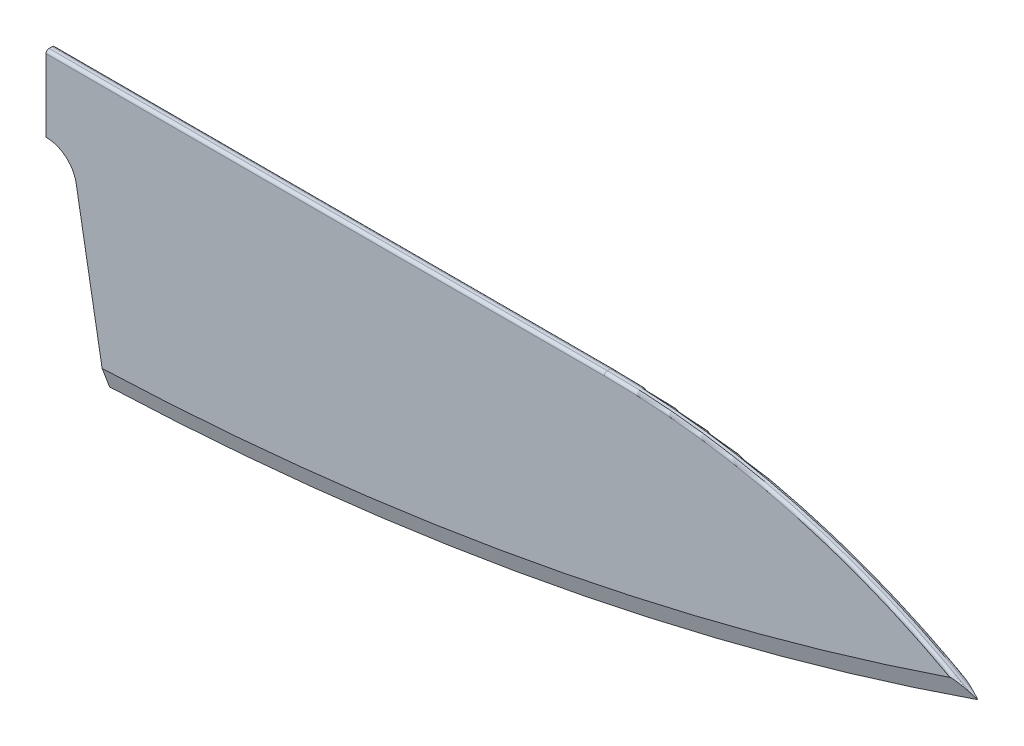
ISO-10303-21;
HEADER;
FILE_DESCRIPTION(('STEP AP214'),'2;1');
FILE_NAME('part.step','',(''),(''),'','','');
FILE_SCHEMA(('AUTOMOTIVE_DESIGN { 1 0 10303 214 1 1 1 1 }'));
ENDSEC;
DATA;
#1=APPLICATION_CONTEXT('core data for automotive mechanical design processes');
#2=APPLICATION_PROTOCOL_DEFINITION('international standard','automotive_design',2000,#1);
#3=PRODUCT_CONTEXT('',#1,'mechanical');
#4=PRODUCT('Part','Part','',(#3));
#5=PRODUCT_RELATED_PRODUCT_CATEGORY('part','',(#4));
#6=PRODUCT_DEFINITION_FORMATION('','',#4);
#7=PRODUCT_DEFINITION_CONTEXT('part definition',#1,'design');
#8=PRODUCT_DEFINITION('design','',#6,#7);
#9=PRODUCT_DEFINITION_SHAPE('','',#8);
#10=(LENGTH_UNIT() NAMED_UNIT(*) SI_UNIT(.MILLI.,.METRE.));
#11=(NAMED_UNIT(*) PLANE_ANGLE_UNIT() SI_UNIT($,.RADIAN.));
#12=(NAMED_UNIT(*) SI_UNIT($,.STERADIAN.) SOLID_ANGLE_UNIT());
#13=UNCERTAINTY_MEASURE_WITH_UNIT(LENGTH_MEASURE(1.E-05),#10,'distance_accuracy_value','');
#14=(GEOMETRIC_REPRESENTATION_CONTEXT(3) GLOBAL_UNCERTAINTY_ASSIGNED_CONTEXT((#13)) GLOBAL_UNIT_ASSIGNED_CONTEXT((#10,
#11,#12)) REPRESENTATION_CONTEXT('',''));
#15=CARTESIAN_POINT('',(0.,0.,0.));
#16=DIRECTION('',(0.,0.,1.));
#17=DIRECTION('',(1.,0.,0.));
#18=AXIS2_PLACEMENT_3D('',#15,#16,#17);
#19=CARTESIAN_POINT('',(180.,-10.,1.5));
#20=DIRECTION('',(1.,0.,0.));
#21=DIRECTION('',(0.,0.,-1.));
#22=AXIS2_PLACEMENT_3D('',#19,#20,#21);
#23=PLANE('',#22);
#24=DIRECTION('',(0.,0.,-1.));
#25=VECTOR('',#24,1.);
#26=CARTESIAN_POINT('',(180.,-10.,1.5));
#27=LINE('',#26,#25);
#28=CARTESIAN_POINT('',(180.,-10.,0.5));
#29=VERTEX_POINT('',#28);
#30=CARTESIAN_POINT('',(180.,-10.,-0.5));
#31=VERTEX_POINT('',#30);
#32=EDGE_CURVE('E268',#29,#31,#27,.T.);
#33=ORIENTED_EDGE('',*,*,#32,.T.);
#34=CARTESIAN_POINT('',(180.,-11.,-0.5));
#35=DIRECTION('',(1.,0.,0.));
#36=DIRECTION('',(0.,0.,-1.));
#37=AXIS2_PLACEMENT_3D('',#34,#35,#36);
#38=CIRCLE('',#37,1.);
#39=CARTESIAN_POINT('',(180.,-11.,-1.5));
#40=VERTEX_POINT('',#39);
#41=EDGE_CURVE('E11',#31,#40,#38,.F.);
#42=ORIENTED_EDGE('',*,*,#41,.T.);
#43=DIRECTION('',(0.,-1.,0.));
#44=VECTOR('',#43,1.);
#45=CARTESIAN_POINT('',(180.,-10.,-1.5));
#46=LINE('',#45,#44);
#47=CARTESIAN_POINT('',(180.,-35.,-1.5));
#48=VERTEX_POINT('',#47);
#49=EDGE_CURVE('E138',#40,#48,#46,.T.);
#50=ORIENTED_EDGE('',*,*,#49,.T.);
#51=DIRECTION('',(0.,0.,-1.));
#52=VECTOR('',#51,1.);
#53=CARTESIAN_POINT('',(180.,-35.,1.5));
#54=LINE('',#53,#52);
#55=CARTESIAN_POINT('',(180.,-35.,1.5));
#56=VERTEX_POINT('',#55);
#57=EDGE_CURVE('E131',#56,#48,#54,.T.);
#58=ORIENTED_EDGE('',*,*,#57,.F.);
#59=DIRECTION('',(0.,-1.,0.));
#60=VECTOR('',#59,1.);
#61=CARTESIAN_POINT('',(180.,-10.,1.5));
#62=LINE('',#61,#60);
#63=CARTESIAN_POINT('',(180.,-11.,1.5));
#64=VERTEX_POINT('',#63);
#65=EDGE_CURVE('E116',#64,#56,#62,.T.);
#66=ORIENTED_EDGE('',*,*,#65,.F.);
#67=CARTESIAN_POINT('',(180.,-11.,0.5));
#68=DIRECTION('',(1.,0.,0.));
#69=DIRECTION('',(0.,0.,-1.));
#70=AXIS2_PLACEMENT_3D('',#67,#68,#69);
#71=CIRCLE('',#70,1.);
#72=EDGE_CURVE('E42',#64,#29,#71,.F.);
#73=ORIENTED_EDGE('',*,*,#72,.T.);
#74=EDGE_LOOP('',(#33,#42,#50,#58,#66,#73));
#75=FACE_BOUND('',#74,.T.);
#76=ADVANCED_FACE('F33',(#75),#23,.F.);
#77=CARTESIAN_POINT('',(180.,-35.,1.5));
#78=DIRECTION('',(0.,1.,0.));
#79=DIRECTION('',(0.,0.,1.));
#80=AXIS2_PLACEMENT_3D('',#77,#78,#79);
#81=PLANE('',#80);
#82=DIRECTION('',(1.,0.,0.));
#83=VECTOR('',#82,1.);
#84=CARTESIAN_POINT('',(180.,-35.,-1.5));
#85=LINE('',#84,#83);
#86=CARTESIAN_POINT('',(180.147749942177,-35.,-1.5));
#87=VERTEX_POINT('',#86);
#88=EDGE_CURVE('E276',#48,#87,#85,.T.);
#89=ORIENTED_EDGE('',*,*,#88,.T.);
#90=DIRECTION('',(0.,0.,-1.));
#91=VECTOR('',#90,1.);
#92=CARTESIAN_POINT('',(180.147749942177,-35.,1.5));
#93=LINE('',#92,#91);
#94=CARTESIAN_POINT('',(180.147749942177,-35.,1.5));
#95=VERTEX_POINT('',#94);
#96=EDGE_CURVE('E133',#95,#87,#93,.T.);
#97=ORIENTED_EDGE('',*,*,#96,.F.);
#98=DIRECTION('',(1.,0.,0.));
#99=VECTOR('',#98,1.);
#100=CARTESIAN_POINT('',(180.,-35.,1.5));
#101=LINE('',#100,#99);
#102=EDGE_CURVE('E120',#56,#95,#101,.T.);
#103=ORIENTED_EDGE('',*,*,#102,.F.);
#104=ORIENTED_EDGE('',*,*,#57,.T.);
#105=EDGE_LOOP('',(#89,#97,#103,#104));
#106=FACE_BOUND('',#105,.T.);
#107=ADVANCED_FACE('F130',(#106),#81,.F.);
#108=CARTESIAN_POINT('',(180.147749942177,-45.,1.5));
#109=DIRECTION('',(0.,0.,-1.));
#110=DIRECTION('',(-1.,0.,0.));
#111=AXIS2_PLACEMENT_3D('',#108,#109,#110);
#112=CYLINDRICAL_SURFACE('',#111,10.);
#113=CARTESIAN_POINT('',(180.147749942177,-45.,-1.5));
#114=DIRECTION('',(0.,0.,-1.));
#115=DIRECTION('',(-1.,0.,0.));
#116=AXIS2_PLACEMENT_3D('',#113,#114,#115);
#117=CIRCLE('',#116,10.);
#118=CARTESIAN_POINT('',(189.995827472299,-43.2635182233307,-1.5));
#119=VERTEX_POINT('',#118);
#120=EDGE_CURVE('E274',#87,#119,#117,.T.);
#121=ORIENTED_EDGE('',*,*,#120,.T.);
#122=DIRECTION('',(0.,0.,-1.));
#123=VECTOR('',#122,1.);
#124=CARTESIAN_POINT('',(189.995827472299,-43.2635182233307,1.5));
#125=LINE('',#124,#123);
#126=CARTESIAN_POINT('',(189.995827472299,-43.2635182233307,1.5));
#127=VERTEX_POINT('',#126);
#128=EDGE_CURVE('E144',#127,#119,#125,.T.);
#129=ORIENTED_EDGE('',*,*,#128,.F.);
#130=CARTESIAN_POINT('',(180.147749942177,-45.,1.5));
#131=DIRECTION('',(0.,0.,-1.));
#132=DIRECTION('',(-1.,0.,0.));
#133=AXIS2_PLACEMENT_3D('',#130,#131,#132);
#134=CIRCLE('',#133,10.);
#135=EDGE_CURVE('E135',#95,#127,#134,.T.);
#136=ORIENTED_EDGE('',*,*,#135,.F.);
#137=ORIENTED_EDGE('',*,*,#96,.T.);
#138=EDGE_LOOP('',(#121,#129,#136,#137));
#139=FACE_BOUND('',#138,.T.);
#140=ADVANCED_FACE('F174',(#139),#112,.F.);
#141=CARTESIAN_POINT('',(189.995827472299,-43.2635182233307,1.5));
#142=DIRECTION('',(0.984807753012209,0.173648177666927,0.));
#143=DIRECTION('',(-0.173648177666927,0.984807753012209,0.));
#144=AXIS2_PLACEMENT_3D('',#141,#142,#143);
#145=PLANE('',#144);
#146=DIRECTION('',(0.173648177666927,-0.984807753012209,0.));
#147=VECTOR('',#146,1.);
#148=CARTESIAN_POINT('',(189.995827472299,-43.2635182233307,-1.5));
#149=LINE('',#148,#147);
#150=CARTESIAN_POINT('',(198.597834340001,-92.0479233843533,-1.5));
#151=VERTEX_POINT('',#150);
#152=EDGE_CURVE('E126',#119,#151,#149,.T.);
#153=ORIENTED_EDGE('',*,*,#152,.T.);
#154=CARTESIAN_POINT('',(198.597834340001,-92.0479233843533,-1.5));
#155=CARTESIAN_POINT('',(198.831529776716,-93.3732760659239,-1.14275957484062));
#156=CARTESIAN_POINT('',(199.065224633407,-94.6986254580133,-0.785506567306787));
#157=CARTESIAN_POINT('',(199.53261318674,-97.3493176632288,-0.0709753874904686));
#158=CARTESIAN_POINT('',(199.766306883382,-98.6746604763549,0.286302784792017));
#159=CARTESIAN_POINT('',(200.,-99.9999999999998,0.643593539448956));
#160=B_SPLINE_CURVE_WITH_KNOTS('',3,(#154,#155,#156,#157,#158,#159),.UNSPECIFIED.,.F.,.F.,(4,2,
4),(0.,4.17721750414407,8.3544350082852),.UNSPECIFIED.);
#161=CARTESIAN_POINT('',(199.579035294314,-97.6125905179427,0.));
#162=VERTEX_POINT('',#161);
#163=EDGE_CURVE('E184',#151,#162,#160,.T.);
#164=ORIENTED_EDGE('',*,*,#163,.T.);
#165=CARTESIAN_POINT('',(200.,-99.9999999999999,-0.643593539448985));
#166=CARTESIAN_POINT('',(199.766306883382,-98.6746604763549,-0.286302784792028));
#167=CARTESIAN_POINT('',(199.53261318674,-97.3493176632288,0.0709753874904697));
#168=CARTESIAN_POINT('',(199.065224633407,-94.6986254580133,0.785506567306798));
#169=CARTESIAN_POINT('',(198.831529776716,-93.3732760659239,1.14275957484063));
#170=CARTESIAN_POINT('',(198.597834340001,-92.0479233843533,1.5));
#171=B_SPLINE_CURVE_WITH_KNOTS('',3,(#165,#166,#167,#168,#169,#170),.UNSPECIFIED.,.F.,.F.,(4,2,
4),(0.,4.17721750414114,8.35443500828521),.UNSPECIFIED.);
#172=CARTESIAN_POINT('',(198.597834340001,-92.0479233843533,1.5));
#173=VERTEX_POINT('',#172);
#174=EDGE_CURVE('E179',#162,#173,#171,.T.);
#175=ORIENTED_EDGE('',*,*,#174,.T.);
#176=DIRECTION('',(0.173648177666927,-0.984807753012209,0.));
#177=VECTOR('',#176,1.);
#178=CARTESIAN_POINT('',(189.995827472299,-43.2635182233307,1.5));
#179=LINE('',#178,#177);
#180=EDGE_CURVE('E246',#127,#173,#179,.T.);
#181=ORIENTED_EDGE('',*,*,#180,.F.);
#182=ORIENTED_EDGE('',*,*,#128,.T.);
#183=EDGE_LOOP('',(#153,#164,#175,#181,#182));
#184=FACE_BOUND('',#183,.T.);
#185=ADVANCED_FACE('F167',(#184),#145,.F.);
#186=CARTESIAN_POINT('',(365.,-250.,1.5));
#187=DIRECTION('',(0.,0.,-1.));
#188=DIRECTION('',(-1.,0.,0.));
#189=AXIS2_PLACEMENT_3D('',#186,#187,#188);
#190=CYLINDRICAL_SURFACE('',#189,240.);
#191=CARTESIAN_POINT('',(490.,-45.121987514521,0.643593539448985));
#192=CARTESIAN_POINT('',(488.495942114908,-44.2043312113068,0.278838372767636));
#193=CARTESIAN_POINT('',(486.981165221059,-43.3028666849665,-0.0822618234806008));
#194=CARTESIAN_POINT('',(484.693425498114,-41.9753352875074,-0.618216463830511));
#195=CARTESIAN_POINT('',(483.928267418784,-41.536945398964,-0.795914762927347));
#196=CARTESIAN_POINT('',(482.392733841631,-40.6683868953586,-1.14940294835419));
#197=CARTESIAN_POINT('',(481.622357722227,-40.2382192839319,-1.32519260059212));
#198=CARTESIAN_POINT('',(480.849457964437,-39.8122194575858,-1.49999999999997));
#199=B_SPLINE_CURVE_WITH_KNOTS('',3,(#191,#192,#193,#194,#195,#196,#197,#198),.UNSPECIFIED.,.F.,
.F.,(4,2,2,4),(0.,5.39757314775405,8.09623711541611,10.7952284130574),.UNSPECIFIED.);
#200=CARTESIAN_POINT('',(487.319020761774,-43.51015240482,0.));
#201=VERTEX_POINT('',#200);
#202=CARTESIAN_POINT('',(485.197782442825,-42.2682183780555,-0.499999999999993));
#203=VERTEX_POINT('',#202);
#204=EDGE_CURVE('E142',#201,#203,#199,.T.);
#205=ORIENTED_EDGE('',*,*,#204,.T.);
#206=CARTESIAN_POINT('',(365.,-250.,-0.5));
#207=DIRECTION('',(0.,0.,-1.));
#208=DIRECTION('',(-1.,0.,0.));
#209=AXIS2_PLACEMENT_3D('',#206,#207,#208);
#210=CIRCLE('',#209,240.);
#211=CARTESIAN_POINT('',(365.,-10.,-0.5));
#212=VERTEX_POINT('',#211);
#213=EDGE_CURVE('E249',#203,#212,#210,.F.);
#214=ORIENTED_EDGE('',*,*,#213,.T.);
#215=DIRECTION('',(0.,0.,-1.));
#216=VECTOR('',#215,1.);
#217=CARTESIAN_POINT('',(365.,-10.,1.5));
#218=LINE('',#217,#216);
#219=CARTESIAN_POINT('',(365.,-10.,0.5));
#220=VERTEX_POINT('',#219);
#221=EDGE_CURVE('E267',#220,#212,#218,.T.);
#222=ORIENTED_EDGE('',*,*,#221,.F.);
#223=CARTESIAN_POINT('',(365.,-250.,0.5));
#224=DIRECTION('',(0.,0.,-1.));
#225=DIRECTION('',(-1.,0.,0.));
#226=AXIS2_PLACEMENT_3D('',#223,#224,#225);
#227=CIRCLE('',#226,240.);
#228=CARTESIAN_POINT('',(485.197782442825,-42.2682183780554,0.500000000000017));
#229=VERTEX_POINT('',#228);
#230=EDGE_CURVE('E240',#220,#229,#227,.T.);
#231=ORIENTED_EDGE('',*,*,#230,.T.);
#232=CARTESIAN_POINT('',(480.849457964437,-39.8122194575857,1.5));
#233=CARTESIAN_POINT('',(481.622357722227,-40.2382192839319,1.32519260059212));
#234=CARTESIAN_POINT('',(482.392733841631,-40.6683868953586,1.14940294835418));
#235=CARTESIAN_POINT('',(483.928267418784,-41.536945398964,0.795914762927346));
#236=CARTESIAN_POINT('',(484.693425498114,-41.9753352875074,0.618216463830525));
#237=CARTESIAN_POINT('',(486.981165221059,-43.3028666849664,0.0822618234806651));
#238=CARTESIAN_POINT('',(488.495942114908,-44.2043312113068,-0.278838372767532));
#239=CARTESIAN_POINT('',(490.,-45.1219875145211,-0.643593539448925));
#240=B_SPLINE_CURVE_WITH_KNOTS('',3,(#232,#233,#234,#235,#236,#237,#238,#239),.UNSPECIFIED.,.F.,
.F.,(4,2,2,4),(0.,2.69899129764124,5.39765526530331,10.7952284130573),.UNSPECIFIED.);
#241=EDGE_CURVE('E140',#229,#201,#240,.T.);
#242=ORIENTED_EDGE('',*,*,#241,.T.);
#243=EDGE_LOOP('',(#205,#214,#222,#231,#242));
#244=FACE_BOUND('',#243,.T.);
#245=ADVANCED_FACE('F161',(#244),#190,.T.);
#246=CARTESIAN_POINT('',(180.,-10.,1.5));
#247=DIRECTION('',(0.,-1.,0.));
#248=DIRECTION('',(0.,0.,-1.));
#249=AXIS2_PLACEMENT_3D('',#246,#247,#248);
#250=PLANE('',#249);
#251=ORIENTED_EDGE('',*,*,#221,.T.);
#252=DIRECTION('',(-1.,0.,0.));
#253=VECTOR('',#252,1.);
#254=CARTESIAN_POINT('',(180.,-10.,-0.5));
#255=LINE('',#254,#253);
#256=EDGE_CURVE('E50',#212,#31,#255,.T.);
#257=ORIENTED_EDGE('',*,*,#256,.T.);
#258=ORIENTED_EDGE('',*,*,#32,.F.);
#259=DIRECTION('',(-1.,0.,0.));
#260=VECTOR('',#259,1.);
#261=CARTESIAN_POINT('',(180.,-10.,0.5));
#262=LINE('',#261,#260);
#263=EDGE_CURVE('E226',#29,#220,#262,.F.);
#264=ORIENTED_EDGE('',*,*,#263,.T.);
#265=EDGE_LOOP('',(#251,#257,#258,#264));
#266=FACE_BOUND('',#265,.T.);
#267=ADVANCED_FACE('F166',(#266),#250,.F.);
#268=CARTESIAN_POINT('',(180.147749942177,-45.,1.5));
#269=DIRECTION('',(0.,0.,-1.));
#270=DIRECTION('',(-1.,0.,0.));
#271=AXIS2_PLACEMENT_3D('',#268,#269,#270);
#272=PLANE('',#271);
#273=CARTESIAN_POINT('',(161.10110338796,899.243151511366,1.5));
#274=DIRECTION('',(0.,0.,-1.));
#275=DIRECTION('',(-1.,0.,0.));
#276=AXIS2_PLACEMENT_3D('',#273,#274,#275);
#277=CIRCLE('',#276,992.);
#278=CARTESIAN_POINT('',(479.56556538503,-40.2484058987669,1.5));
#279=VERTEX_POINT('',#278);
#280=EDGE_CURVE('E189',#173,#279,#277,.F.);
#281=ORIENTED_EDGE('',*,*,#280,.T.);
#282=CARTESIAN_POINT('',(365.,-250.,1.5));
#283=DIRECTION('',(0.,0.,-1.));
#284=DIRECTION('',(-1.,0.,0.));
#285=AXIS2_PLACEMENT_3D('',#282,#283,#284);
#286=CIRCLE('',#285,239.);
#287=CARTESIAN_POINT('',(365.,-11.,1.5));
#288=VERTEX_POINT('',#287);
#289=EDGE_CURVE('E227',#279,#288,#286,.F.);
#290=ORIENTED_EDGE('',*,*,#289,.T.);
#291=DIRECTION('',(-1.,0.,0.));
#292=VECTOR('',#291,1.);
#293=CARTESIAN_POINT('',(180.147749942177,-11.,1.5));
#294=LINE('',#293,#292);
#295=EDGE_CURVE('E124',#288,#64,#294,.T.);
#296=ORIENTED_EDGE('',*,*,#295,.T.);
#297=ORIENTED_EDGE('',*,*,#65,.T.);
#298=ORIENTED_EDGE('',*,*,#102,.T.);
#299=ORIENTED_EDGE('',*,*,#135,.T.);
#300=ORIENTED_EDGE('',*,*,#180,.T.);
#301=EDGE_LOOP('',(#281,#290,#296,#297,#298,#299,#300));
#302=FACE_BOUND('',#301,.T.);
#303=ADVANCED_FACE('F119',(#302),#272,.F.);
#304=CARTESIAN_POINT('',(180.147749942177,-45.,-1.5));
#305=DIRECTION('',(0.,0.,-1.));
#306=DIRECTION('',(-1.,0.,0.));
#307=AXIS2_PLACEMENT_3D('',#304,#305,#306);
#308=PLANE('',#307);
#309=DIRECTION('',(-1.,0.,0.));
#310=VECTOR('',#309,1.);
#311=CARTESIAN_POINT('',(365.,-11.,-1.5));
#312=LINE('',#311,#310);
#313=CARTESIAN_POINT('',(365.,-11.,-1.5));
#314=VERTEX_POINT('',#313);
#315=EDGE_CURVE('E254',#40,#314,#312,.F.);
#316=ORIENTED_EDGE('',*,*,#315,.T.);
#317=CARTESIAN_POINT('',(365.,-250.,-1.5));
#318=DIRECTION('',(0.,0.,-1.));
#319=DIRECTION('',(-1.,0.,0.));
#320=AXIS2_PLACEMENT_3D('',#317,#318,#319);
#321=CIRCLE('',#320,239.);
#322=CARTESIAN_POINT('',(479.56556538503,-40.2484058987669,-1.5));
#323=VERTEX_POINT('',#322);
#324=EDGE_CURVE('E206',#314,#323,#321,.T.);
#325=ORIENTED_EDGE('',*,*,#324,.T.);
#326=CARTESIAN_POINT('',(161.10110338796,899.243151511366,-1.5));
#327=DIRECTION('',(0.,0.,-1.));
#328=DIRECTION('',(-1.,0.,0.));
#329=AXIS2_PLACEMENT_3D('',#326,#327,#328);
#330=CIRCLE('',#329,992.);
#331=EDGE_CURVE('E261',#323,#151,#330,.T.);
#332=ORIENTED_EDGE('',*,*,#331,.T.);
#333=ORIENTED_EDGE('',*,*,#152,.F.);
#334=ORIENTED_EDGE('',*,*,#120,.F.);
#335=ORIENTED_EDGE('',*,*,#88,.F.);
#336=ORIENTED_EDGE('',*,*,#49,.F.);
#337=EDGE_LOOP('',(#316,#325,#332,#333,#334,#335,#336));
#338=FACE_BOUND('',#337,.T.);
#339=ADVANCED_FACE('F259',(#338),#308,.T.);
#340=CARTESIAN_POINT('',(161.10110338796,899.243151511366,1.5));
#341=DIRECTION('',(0.,0.,-1.));
#342=DIRECTION('',(-1.,0.,0.));
#343=AXIS2_PLACEMENT_3D('',#340,#341,#342);
#344=CONICAL_SURFACE('',#343,992.,1.30899693899575);
#345=ORIENTED_EDGE('',*,*,#241,.F.);
#346=CARTESIAN_POINT('',(485.197782442825,-42.2682183780554,0.5));
#347=CARTESIAN_POINT('',(485.055050042839,-42.1856495415993,0.53336773853693));
#348=CARTESIAN_POINT('',(484.911359637246,-42.104614723811,0.566425649707295));
#349=CARTESIAN_POINT('',(484.622147878832,-41.9455881786135,0.631919993470637));
#350=CARTESIAN_POINT('',(484.47662637118,-41.8675967108578,0.664356372915931));
#351=CARTESIAN_POINT('',(484.186255407459,-41.7158964735886,0.728074898954213));
#352=CARTESIAN_POINT('',(484.041433871472,-41.6421385278863,0.759367246439356));
#353=CARTESIAN_POINT('',(483.750174764387,-41.4976334193403,0.821318839510211));
#354=CARTESIAN_POINT('',(483.603737309311,-41.4268860420886,0.851978130100908));
#355=CARTESIAN_POINT('',(483.316860137203,-41.2921202993303,0.911059003929566));
#356=CARTESIAN_POINT('',(483.176501989146,-41.2279431593567,0.939514303157274));
#357=CARTESIAN_POINT('',(482.894275677473,-41.1026178784484,0.995777718747537));
#358=CARTESIAN_POINT('',(482.752407225138,-41.0414703297757,1.02358570800699));
#359=CARTESIAN_POINT('',(482.464986561445,-40.9216422187835,1.07888475865994));
#360=CARTESIAN_POINT('',(482.319411011128,-40.863012397068,1.10636481532962));
#361=CARTESIAN_POINT('',(482.026653898455,-40.7497632904961,1.16043538617668));
#362=CARTESIAN_POINT('',(481.879473449499,-40.6951414060684,1.18702647074246));
#363=CARTESIAN_POINT('',(481.581177574997,-40.5899318473886,1.23951370459381));
#364=CARTESIAN_POINT('',(481.430035880637,-40.5394104489363,1.2653951477946));
#365=CARTESIAN_POINT('',(481.201466829375,-40.4683411871446,1.30317235291897));
#366=CARTESIAN_POINT('',(481.124867872002,-40.4454104234108,1.3156059317783));
#367=CARTESIAN_POINT('',(480.971067141397,-40.4014550607716,1.34003815958699));
#368=CARTESIAN_POINT('',(480.893865478768,-40.3804301206628,1.352036886157));
#369=CARTESIAN_POINT('',(480.740882530987,-40.3412415853744,1.37518228151624));
#370=CARTESIAN_POINT('',(480.6651194273,-40.3230159036169,1.38634322733503));
#371=CARTESIAN_POINT('',(480.512819364325,-40.289344447185,1.40802306532033));
#372=CARTESIAN_POINT('',(480.43628190511,-40.2739006078621,1.41854150715475));
#373=CARTESIAN_POINT('',(480.282712303672,-40.2468497378847,1.43864384476663));
#374=CARTESIAN_POINT('',(480.205683326524,-40.235227735746,1.44823128096203));
#375=CARTESIAN_POINT('',(480.050879504599,-40.2174731522886,1.46607363681666));
#376=CARTESIAN_POINT('',(479.97310588355,-40.2113327469967,1.47433044185901));
#377=CARTESIAN_POINT('',(479.840018343173,-40.2088808148125,1.48641188321483));
#378=CARTESIAN_POINT('',(479.784844881376,-40.2102047152598,1.49082550166632));
#379=CARTESIAN_POINT('',(479.702188780863,-40.2182818430376,1.49588954529594));
#380=CARTESIAN_POINT('',(479.674505375107,-40.2220263428239,1.49732158919952));
#381=CARTESIAN_POINT('',(479.619560401388,-40.2326158330481,1.49936198613169));
#382=CARTESIAN_POINT('',(479.592302267436,-40.2394789104603,1.49996545031875));
#383=CARTESIAN_POINT('',(479.56556538503,-40.2484058987669,1.5));
#384=B_SPLINE_CURVE_WITH_KNOTS('',3,(#346,#347,#348,#349,#350,#351,#352,#353,#354,#355,#356,
#357,#358,#359,#360,#361,#362,#363,#364,#365,#366,#367,#368,#369,#370,#371,#372,#373,#374,#375,
#376,#377,#378,#379,#380,#381,#382,#383),.UNSPECIFIED.,.F.,.F.,(4,2,2,2,2,2,2,2,2,2,2,2,2,2,2,2,
2,2,4),(0.,0.504697520989306,1.00943800819544,1.50592512983393,2.00237683306576,
2.47314891371343,2.94401266649466,3.42193692444367,3.89954840645161,4.38376828741289,
4.62650428928337,4.86919674747537,5.10531434615647,5.34159558469535,5.57693988327772,
5.81194773151151,5.97765013850527,6.06140799157288,6.14565794492111),.UNSPECIFIED.);
#385=EDGE_CURVE('E221',#229,#279,#384,.T.);
#386=ORIENTED_EDGE('',*,*,#385,.T.);
#387=ORIENTED_EDGE('',*,*,#280,.F.);
#388=ORIENTED_EDGE('',*,*,#174,.F.);
#389=CARTESIAN_POINT('',(161.10110338796,899.243151511366,0.));
#390=DIRECTION('',(0.,0.,-1.));
#391=DIRECTION('',(-1.,0.,0.));
#392=AXIS2_PLACEMENT_3D('',#389,#390,#391);
#393=CIRCLE('',#392,997.598076211353);
#394=EDGE_CURVE('E231',#201,#162,#393,.T.);
#395=ORIENTED_EDGE('',*,*,#394,.F.);
#396=EDGE_LOOP('',(#345,#386,#387,#388,#395));
#397=FACE_BOUND('',#396,.T.);
#398=ADVANCED_FACE('F158',(#397),#344,.T.);
#399=CARTESIAN_POINT('',(161.10110338796,899.243151511366,0.643593539448985));
#400=DIRECTION('',(0.,0.,1.));
#401=DIRECTION('',(1.,0.,0.));
#402=AXIS2_PLACEMENT_3D('',#399,#400,#401);
#403=CONICAL_SURFACE('',#402,1000.,1.30899693899575);
#404=ORIENTED_EDGE('',*,*,#331,.F.);
#405=CARTESIAN_POINT('',(479.56556538503,-40.2484058987669,-1.5));
#406=CARTESIAN_POINT('',(479.58170244677,-40.242957460959,-1.49999451209599));
#407=CARTESIAN_POINT('',(479.598074658188,-40.238310283804,-1.49976534506108));
#408=CARTESIAN_POINT('',(479.631093079338,-40.2303355514784,-1.49894833627991));
#409=CARTESIAN_POINT('',(479.647738567159,-40.2270049668021,-1.49836132595129));
#410=CARTESIAN_POINT('',(479.697681271245,-40.2185724386475,-1.49620375173318));
#411=CARTESIAN_POINT('',(479.731205161413,-40.2149646603664,-1.49423419283316));
#412=CARTESIAN_POINT('',(479.797941884358,-40.2104700452966,-1.48963055634651));
#413=CARTESIAN_POINT('',(479.831153620403,-40.2095510661633,-1.48700473945573));
#414=CARTESIAN_POINT('',(479.897597835464,-40.2096306879339,-1.48126395330326));
#415=CARTESIAN_POINT('',(479.930830200588,-40.2106334932469,-1.47814792526699));
#416=CARTESIAN_POINT('',(480.020259347633,-40.2153006243395,-1.46926209133039));
#417=CARTESIAN_POINT('',(480.076347440083,-40.2203312473615,-1.46315424981442));
#418=CARTESIAN_POINT('',(480.188116588419,-40.233279069656,-1.45023916897843));
#419=CARTESIAN_POINT('',(480.24379737664,-40.2411980187959,-1.44343150747789));
#420=CARTESIAN_POINT('',(480.410282113058,-40.268162387266,-1.42223983954777));
#421=CARTESIAN_POINT('',(480.520465634041,-40.2904100625526,-1.40709389418256));
#422=CARTESIAN_POINT('',(480.74270484358,-40.3410985369181,-1.3750620416854));
#423=CARTESIAN_POINT('',(480.854714444831,-40.3697082160561,-1.35813703975809));
#424=CARTESIAN_POINT('',(481.077316810481,-40.4311217370541,-1.32333813027999));
#425=CARTESIAN_POINT('',(481.18791067198,-40.4639220839448,-1.30546502062271));
#426=CARTESIAN_POINT('',(481.480165250054,-40.5553922290215,-1.25700898618337));
#427=CARTESIAN_POINT('',(481.660824049534,-40.6169104334261,-1.22578410930296));
#428=CARTESIAN_POINT('',(482.019492749124,-40.7466046489678,-1.16185735096538));
#429=CARTESIAN_POINT('',(482.19750192026,-40.8147824546786,-1.12915507267358));
#430=CARTESIAN_POINT('',(482.551371305752,-40.9567022922088,-1.06250904909568));
#431=CARTESIAN_POINT('',(482.727227815198,-41.0304526783054,-1.02856348078815));
#432=CARTESIAN_POINT('',(483.076642689291,-41.182697777495,-0.95965297539185));
#433=CARTESIAN_POINT('',(483.250201307591,-41.2611919615286,-0.92468815220136));
#434=CARTESIAN_POINT('',(483.574312959749,-41.4127889558726,-0.858108268514211));
#435=CARTESIAN_POINT('',(483.725117399086,-41.4854012024011,-0.826597435680897));
#436=CARTESIAN_POINT('',(484.025008235298,-41.6338153321053,-0.762905550794393));
#437=CARTESIAN_POINT('',(484.174094603834,-41.7096172677996,-0.730724487710187));
#438=CARTESIAN_POINT('',(484.470033518366,-41.8640822870174,-0.665821042439651));
#439=CARTESIAN_POINT('',(484.616891657371,-41.9427355131579,-0.633100705378617));
#440=CARTESIAN_POINT('',(484.908752319296,-42.1031447944784,-0.56702537665263));
#441=CARTESIAN_POINT('',(485.053754901451,-42.184900750278,-0.533670405332026));
#442=CARTESIAN_POINT('',(485.197782442825,-42.2682183780554,-0.500000000000004));
#443=B_SPLINE_CURVE_WITH_KNOTS('',3,(#405,#406,#407,#408,#409,#410,#411,#412,#413,#414,#415,
#416,#417,#418,#419,#420,#421,#422,#423,#424,#425,#426,#427,#428,#429,#430,#431,#432,#433,#434,
#435,#436,#437,#438,#439,#440,#441,#442),.UNSPECIFIED.,.F.,.F.,(4,2,2,2,2,2,2,2,2,2,2,2,2,2,2,2,
2,2,4),(0.,0.0510251130171284,0.101932123107408,0.203062555025301,0.302979016108841,
0.403114320300517,0.572916421614223,0.742821567403945,1.08282137531448,1.4332394163545,
1.7833670974307,2.3633168095311,2.9434232350311,3.52441728928298,4.10534666643355,
4.61625390815713,5.12716956532761,5.63646167322624,6.14573748226143),.UNSPECIFIED.);
#444=EDGE_CURVE('E200',#323,#203,#443,.T.);
#445=ORIENTED_EDGE('',*,*,#444,.T.);
#446=ORIENTED_EDGE('',*,*,#204,.F.);
#447=ORIENTED_EDGE('',*,*,#394,.T.);
#448=ORIENTED_EDGE('',*,*,#163,.F.);
#449=EDGE_LOOP('',(#404,#445,#446,#447,#448));
#450=FACE_BOUND('',#449,.T.);
#451=ADVANCED_FACE('F191',(#450),#403,.T.);
#452=CARTESIAN_POINT('',(180.,-11.,-0.5));
#453=DIRECTION('',(1.,0.,0.));
#454=DIRECTION('',(0.,0.,-1.));
#455=AXIS2_PLACEMENT_3D('',#452,#453,#454);
#456=CYLINDRICAL_SURFACE('',#455,1.);
#457=ORIENTED_EDGE('',*,*,#41,.F.);
#458=ORIENTED_EDGE('',*,*,#256,.F.);
#459=CARTESIAN_POINT('',(365.,-11.,-0.5));
#460=DIRECTION('',(1.,0.,0.));
#461=DIRECTION('',(0.,0.,-1.));
#462=AXIS2_PLACEMENT_3D('',#459,#460,#461);
#463=CIRCLE('',#462,1.);
#464=EDGE_CURVE('E230',#314,#212,#463,.T.);
#465=ORIENTED_EDGE('',*,*,#464,.F.);
#466=ORIENTED_EDGE('',*,*,#315,.F.);
#467=EDGE_LOOP('',(#457,#458,#465,#466));
#468=FACE_BOUND('',#467,.T.);
#469=ADVANCED_FACE('F195',(#468),#456,.T.);
#470=CARTESIAN_POINT('',(365.,-250.,-0.5));
#471=DIRECTION('',(0.,0.,-1.));
#472=DIRECTION('',(-1.,0.,0.));
#473=AXIS2_PLACEMENT_3D('',#470,#471,#472);
#474=TOROIDAL_SURFACE('',#473,239.,1.);
#475=ORIENTED_EDGE('',*,*,#444,.F.);
#476=ORIENTED_EDGE('',*,*,#324,.F.);
#477=ORIENTED_EDGE('',*,*,#464,.T.);
#478=ORIENTED_EDGE('',*,*,#213,.F.);
#479=EDGE_LOOP('',(#475,#476,#477,#478));
#480=FACE_BOUND('',#479,.T.);
#481=ADVANCED_FACE('F209',(#480),#474,.T.);
#482=CARTESIAN_POINT('',(180.147749942177,-11.,0.5));
#483=DIRECTION('',(-1.,0.,0.));
#484=DIRECTION('',(0.,0.,1.));
#485=AXIS2_PLACEMENT_3D('',#482,#483,#484);
#486=CYLINDRICAL_SURFACE('',#485,1.);
#487=ORIENTED_EDGE('',*,*,#72,.F.);
#488=ORIENTED_EDGE('',*,*,#295,.F.);
#489=CARTESIAN_POINT('',(365.,-11.,0.5));
#490=DIRECTION('',(1.,0.,0.));
#491=DIRECTION('',(0.,0.,-1.));
#492=AXIS2_PLACEMENT_3D('',#489,#490,#491);
#493=CIRCLE('',#492,1.);
#494=EDGE_CURVE('E37',#220,#288,#493,.T.);
#495=ORIENTED_EDGE('',*,*,#494,.F.);
#496=ORIENTED_EDGE('',*,*,#263,.F.);
#497=EDGE_LOOP('',(#487,#488,#495,#496));
#498=FACE_BOUND('',#497,.T.);
#499=ADVANCED_FACE('F35',(#498),#486,.T.);
#500=CARTESIAN_POINT('',(365.,-250.,0.5));
#501=DIRECTION('',(0.,0.,-1.));
#502=DIRECTION('',(-1.,0.,0.));
#503=AXIS2_PLACEMENT_3D('',#500,#501,#502);
#504=TOROIDAL_SURFACE('',#503,239.,1.);
#505=ORIENTED_EDGE('',*,*,#385,.F.);
#506=ORIENTED_EDGE('',*,*,#230,.F.);
#507=ORIENTED_EDGE('',*,*,#494,.T.);
#508=ORIENTED_EDGE('',*,*,#289,.F.);
#509=EDGE_LOOP('',(#505,#506,#507,#508));
#510=FACE_BOUND('',#509,.T.);
#511=ADVANCED_FACE('F216',(#510),#504,.T.);
#512=CLOSED_SHELL('',(#76,#107,#140,#185,#245,#267,#303,#339,#398,#451,#469,#481,#499,#511));
#513=MANIFOLD_SOLID_BREP('B2',#512);
#514=ADVANCED_BREP_SHAPE_REPRESENTATION('',(#18,#513),#14);
#515=SHAPE_DEFINITION_REPRESENTATION(#9,#514);
ENDSEC;
END-ISO-10303-21;
